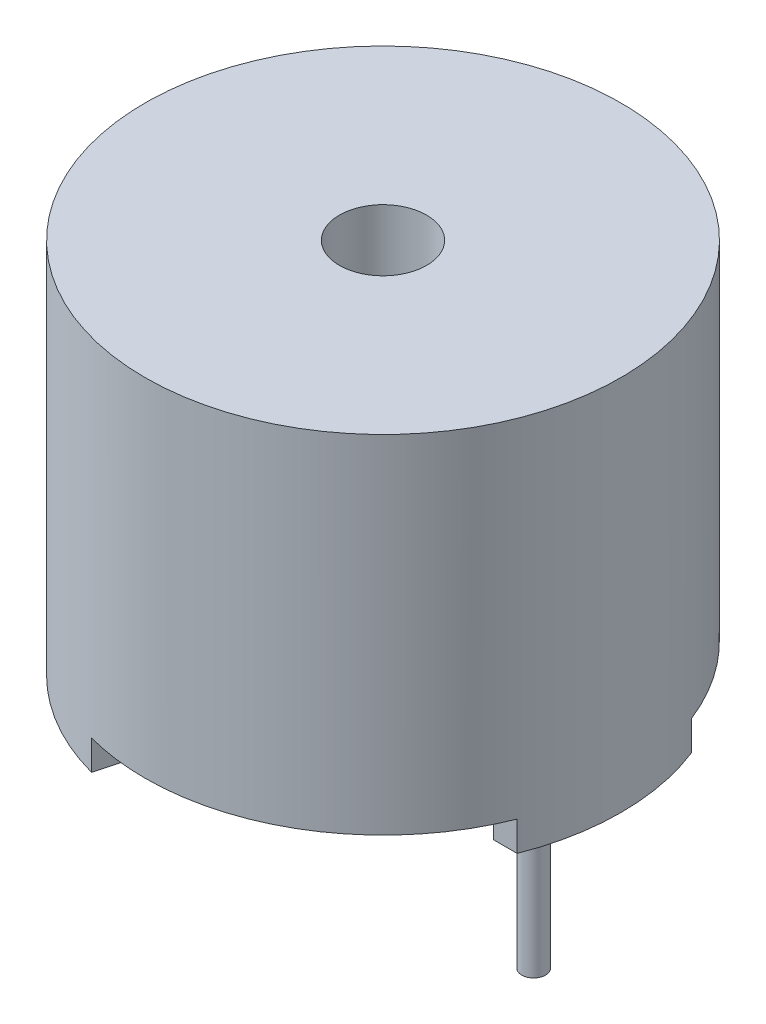
ISO-10303-21;
HEADER;
FILE_DESCRIPTION(('STEP AP214'),'2;1');
FILE_NAME('part.step','',(''),(''),'','','');
FILE_SCHEMA(('AUTOMOTIVE_DESIGN { 1 0 10303 214 1 1 1 1 }'));
ENDSEC;
DATA;
#1=APPLICATION_CONTEXT('core data for automotive mechanical design processes');
#2=APPLICATION_PROTOCOL_DEFINITION('international standard','automotive_design',2000,#1);
#3=PRODUCT_CONTEXT('',#1,'mechanical');
#4=PRODUCT('Part','Part','',(#3));
#5=PRODUCT_RELATED_PRODUCT_CATEGORY('part','',(#4));
#6=PRODUCT_DEFINITION_FORMATION('','',#4);
#7=PRODUCT_DEFINITION_CONTEXT('part definition',#1,'design');
#8=PRODUCT_DEFINITION('design','',#6,#7);
#9=PRODUCT_DEFINITION_SHAPE('','',#8);
#10=(LENGTH_UNIT() NAMED_UNIT(*) SI_UNIT(.MILLI.,.METRE.));
#11=(NAMED_UNIT(*) PLANE_ANGLE_UNIT() SI_UNIT($,.RADIAN.));
#12=(NAMED_UNIT(*) SI_UNIT($,.STERADIAN.) SOLID_ANGLE_UNIT());
#13=UNCERTAINTY_MEASURE_WITH_UNIT(LENGTH_MEASURE(1.E-05),#10,'distance_accuracy_value','');
#14=(GEOMETRIC_REPRESENTATION_CONTEXT(3) GLOBAL_UNCERTAINTY_ASSIGNED_CONTEXT((#13)) GLOBAL_UNIT_ASSIGNED_CONTEXT((#10,
#11,#12)) REPRESENTATION_CONTEXT('',''));
#15=CARTESIAN_POINT('',(0.,0.,0.));
#16=DIRECTION('',(0.,0.,1.));
#17=DIRECTION('',(1.,0.,0.));
#18=AXIS2_PLACEMENT_3D('',#15,#16,#17);
#19=CARTESIAN_POINT('',(0.,6.5,0.));
#20=DIRECTION('',(0.,1.,0.));
#21=DIRECTION('',(0.,0.,1.));
#22=AXIS2_PLACEMENT_3D('',#19,#20,#21);
#23=PLANE('',#22);
#24=CARTESIAN_POINT('',(0.,6.5,0.));
#25=DIRECTION('',(0.,-1.,0.));
#26=DIRECTION('',(0.,0.,-1.));
#27=AXIS2_PLACEMENT_3D('',#24,#25,#26);
#28=CIRCLE('',#27,1.1);
#29=CARTESIAN_POINT('',(0.,6.5,-1.1));
#30=VERTEX_POINT('',#29);
#31=EDGE_CURVE('E20',#30,#30,#28,.F.);
#32=ORIENTED_EDGE('',*,*,#31,.T.);
#33=EDGE_LOOP('',(#32));
#34=FACE_BOUND('',#33,.T.);
#35=ADVANCED_FACE('F17',(#34),#23,.T.);
#36=CARTESIAN_POINT('',(0.,-3.5,0.));
#37=DIRECTION('',(0.,1.,0.));
#38=DIRECTION('',(0.,0.,1.));
#39=AXIS2_PLACEMENT_3D('',#36,#37,#38);
#40=PLANE('',#39);
#41=CARTESIAN_POINT('',(-3.8,-3.49999999997408,0.));
#42=DIRECTION('',(0.,1.,0.));
#43=DIRECTION('',(0.,0.,1.));
#44=AXIS2_PLACEMENT_3D('',#41,#42,#43);
#45=CIRCLE('',#44,0.3);
#46=CARTESIAN_POINT('',(-3.8,-3.49999999997408,0.299999999999999));
#47=VERTEX_POINT('',#46);
#48=EDGE_CURVE('E160',#47,#47,#45,.T.);
#49=ORIENTED_EDGE('',*,*,#48,.F.);
#50=EDGE_LOOP('',(#49));
#51=FACE_BOUND('',#50,.T.);
#52=ADVANCED_FACE('F448',(#51),#40,.F.);
#53=CARTESIAN_POINT('',(3.8,-4.5,0.));
#54=DIRECTION('',(0.,-1.,0.));
#55=DIRECTION('',(0.,0.,-1.));
#56=AXIS2_PLACEMENT_3D('',#53,#54,#55);
#57=PLANE('',#56);
#58=CARTESIAN_POINT('',(3.8,-4.50000000000728,0.));
#59=DIRECTION('',(0.,1.,0.));
#60=DIRECTION('',(0.,0.,1.));
#61=AXIS2_PLACEMENT_3D('',#58,#59,#60);
#62=CIRCLE('',#61,0.3);
#63=CARTESIAN_POINT('',(3.8,-4.50000000000728,0.3));
#64=VERTEX_POINT('',#63);
#65=EDGE_CURVE('E157',#64,#64,#62,.T.);
#66=ORIENTED_EDGE('',*,*,#65,.F.);
#67=EDGE_LOOP('',(#66));
#68=FACE_BOUND('',#67,.T.);
#69=ADVANCED_FACE('F438',(#68),#57,.T.);
#70=CARTESIAN_POINT('',(0.,6.5,0.));
#71=DIRECTION('',(0.,-1.,0.));
#72=DIRECTION('',(0.,0.,-1.));
#73=AXIS2_PLACEMENT_3D('',#70,#71,#72);
#74=CYLINDRICAL_SURFACE('',#73,1.1);
#75=CARTESIAN_POINT('',(0.,9.5,0.));
#76=DIRECTION('',(0.,-1.,0.));
#77=DIRECTION('',(0.,0.,-1.));
#78=AXIS2_PLACEMENT_3D('',#75,#76,#77);
#79=CIRCLE('',#78,1.1);
#80=CARTESIAN_POINT('',(0.,9.5,-1.1));
#81=VERTEX_POINT('',#80);
#82=EDGE_CURVE('E106',#81,#81,#79,.T.);
#83=ORIENTED_EDGE('',*,*,#82,.F.);
#84=EDGE_LOOP('',(#83));
#85=FACE_BOUND('',#84,.T.);
#86=ORIENTED_EDGE('',*,*,#31,.F.);
#87=EDGE_LOOP('',(#86));
#88=FACE_BOUND('',#87,.T.);
#89=ADVANCED_FACE('F429',(#85,#88),#74,.F.);
#90=CARTESIAN_POINT('',(0.,0.,0.));
#91=DIRECTION('',(0.,1.,0.));
#92=DIRECTION('',(0.,0.,1.));
#93=AXIS2_PLACEMENT_3D('',#90,#91,#92);
#94=PLANE('',#93);
#95=CARTESIAN_POINT('',(0.,0.,0.));
#96=DIRECTION('',(0.,1.,0.));
#97=DIRECTION('',(0.,0.,1.));
#98=AXIS2_PLACEMENT_3D('',#95,#96,#97);
#99=CIRCLE('',#98,5.446233822217);
#100=CARTESIAN_POINT('',(4.98211429478096,0.,2.2));
#101=VERTEX_POINT('',#100);
#102=CARTESIAN_POINT('',(4.98211429478093,0.,-2.19999999999999));
#103=VERTEX_POINT('',#102);
#104=EDGE_CURVE('E80',#101,#103,#99,.T.);
#105=ORIENTED_EDGE('',*,*,#104,.T.);
#106=DIRECTION('',(-1.,0.,0.));
#107=VECTOR('',#106,1.);
#108=CARTESIAN_POINT('',(5.582114294781,0.,-2.2));
#109=LINE('',#108,#107);
#110=CARTESIAN_POINT('',(5.58211429478114,0.,-2.20000000000002));
#111=VERTEX_POINT('',#110);
#112=EDGE_CURVE('E69',#111,#103,#109,.T.);
#113=ORIENTED_EDGE('',*,*,#112,.F.);
#114=CARTESIAN_POINT('',(0.,0.,0.));
#115=DIRECTION('',(0.,1.,0.));
#116=DIRECTION('',(0.,0.,1.));
#117=AXIS2_PLACEMENT_3D('',#114,#115,#116);
#118=CIRCLE('',#117,6.);
#119=CARTESIAN_POINT('',(5.58211429478114,0.,2.20000000000003));
#120=VERTEX_POINT('',#119);
#121=EDGE_CURVE('E96',#120,#111,#118,.T.);
#122=ORIENTED_EDGE('',*,*,#121,.F.);
#123=DIRECTION('',(1.,0.,0.));
#124=VECTOR('',#123,1.);
#125=CARTESIAN_POINT('',(5.582114294781,0.,2.2));
#126=LINE('',#125,#124);
#127=EDGE_CURVE('E63',#101,#120,#126,.T.);
#128=ORIENTED_EDGE('',*,*,#127,.F.);
#129=EDGE_LOOP('',(#105,#113,#122,#128));
#130=FACE_BOUND('',#129,.T.);
#131=ADVANCED_FACE('F81',(#130),#94,.F.);
#132=CARTESIAN_POINT('',(0.,0.75,0.));
#133=DIRECTION('',(0.,1.,0.));
#134=DIRECTION('',(0.,0.,1.));
#135=AXIS2_PLACEMENT_3D('',#132,#133,#134);
#136=CYLINDRICAL_SURFACE('',#135,5.4);
#137=DIRECTION('',(0.,1.,0.));
#138=VECTOR('',#137,1.);
#139=CARTESIAN_POINT('',(-1.39762284355335,0.75,-5.21599946196117));
#140=LINE('',#139,#138);
#141=CARTESIAN_POINT('',(-1.39762284355366,0.75,-5.21599946196102));
#142=VERTEX_POINT('',#141);
#143=CARTESIAN_POINT('',(-1.39762284355366,0.,-5.21599946196102));
#144=VERTEX_POINT('',#143);
#145=EDGE_CURVE('E95',#142,#144,#140,.F.);
#146=ORIENTED_EDGE('',*,*,#145,.F.);
#147=CARTESIAN_POINT('',(0.,0.75,0.));
#148=DIRECTION('',(0.,1.,0.));
#149=DIRECTION('',(0.,0.,1.));
#150=AXIS2_PLACEMENT_3D('',#147,#148,#149);
#151=CIRCLE('',#150,5.4);
#152=CARTESIAN_POINT('',(-3.81837661840718,0.75,-3.81837661840718));
#153=VERTEX_POINT('',#152);
#154=EDGE_CURVE('E142',#153,#142,#151,.F.);
#155=ORIENTED_EDGE('',*,*,#154,.F.);
#156=DIRECTION('',(0.,1.,0.));
#157=VECTOR('',#156,1.);
#158=CARTESIAN_POINT('',(-3.818376618407,0.75,-3.818376618407));
#159=LINE('',#158,#157);
#160=CARTESIAN_POINT('',(-3.81837661840718,0.,-3.81837661840718));
#161=VERTEX_POINT('',#160);
#162=EDGE_CURVE('E100',#161,#153,#159,.T.);
#163=ORIENTED_EDGE('',*,*,#162,.F.);
#164=CARTESIAN_POINT('',(0.,0.,0.));
#165=DIRECTION('',(0.,1.,0.));
#166=DIRECTION('',(0.,0.,1.));
#167=AXIS2_PLACEMENT_3D('',#164,#165,#166);
#168=CIRCLE('',#167,5.4);
#169=EDGE_CURVE('E99',#161,#144,#168,.F.);
#170=ORIENTED_EDGE('',*,*,#169,.T.);
#171=EDGE_LOOP('',(#146,#155,#163,#170));
#172=FACE_BOUND('',#171,.T.);
#173=ADVANCED_FACE('F411',(#172),#136,.F.);
#174=CARTESIAN_POINT('',(5.582114294781,0.75,-2.2));
#175=DIRECTION('',(0.,0.,-1.));
#176=DIRECTION('',(-1.,0.,0.));
#177=AXIS2_PLACEMENT_3D('',#174,#175,#176);
#178=PLANE('',#177);
#179=DIRECTION('',(1.,0.,0.));
#180=VECTOR('',#179,1.);
#181=CARTESIAN_POINT('',(0.274198215041,0.75,-2.2));
#182=LINE('',#181,#180);
#183=CARTESIAN_POINT('',(5.58211429478114,0.750000000000001,-2.20000000000002));
#184=VERTEX_POINT('',#183);
#185=CARTESIAN_POINT('',(4.98211429478093,0.75,-2.19999999999999));
#186=VERTEX_POINT('',#185);
#187=EDGE_CURVE('E141',#184,#186,#182,.F.);
#188=ORIENTED_EDGE('',*,*,#187,.F.);
#189=DIRECTION('',(0.,1.,0.));
#190=VECTOR('',#189,1.);
#191=CARTESIAN_POINT('',(5.58211429478113,9.5,-2.20000000000005));
#192=LINE('',#191,#190);
#193=EDGE_CURVE('E77',#111,#184,#192,.T.);
#194=ORIENTED_EDGE('',*,*,#193,.F.);
#195=ORIENTED_EDGE('',*,*,#112,.T.);
#196=DIRECTION('',(0.,1.,0.));
#197=VECTOR('',#196,1.);
#198=CARTESIAN_POINT('',(4.98211429478093,0.75,-2.19999999999997));
#199=LINE('',#198,#197);
#200=EDGE_CURVE('E74',#103,#186,#199,.T.);
#201=ORIENTED_EDGE('',*,*,#200,.T.);
#202=EDGE_LOOP('',(#188,#194,#195,#201));
#203=FACE_BOUND('',#202,.T.);
#204=ADVANCED_FACE('F71',(#203),#178,.T.);
#205=CARTESIAN_POINT('',(0.,0.75,0.));
#206=DIRECTION('',(0.,1.,0.));
#207=DIRECTION('',(0.,0.,1.));
#208=AXIS2_PLACEMENT_3D('',#205,#206,#207);
#209=CYLINDRICAL_SURFACE('',#208,5.446233822217);
#210=DIRECTION('',(0.,-1.,0.));
#211=VECTOR('',#210,1.);
#212=CARTESIAN_POINT('',(4.982114294781,0.75,2.2));
#213=LINE('',#212,#211);
#214=CARTESIAN_POINT('',(4.98211429478096,0.75,2.2));
#215=VERTEX_POINT('',#214);
#216=EDGE_CURVE('E92',#215,#101,#213,.T.);
#217=ORIENTED_EDGE('',*,*,#216,.F.);
#218=CARTESIAN_POINT('',(0.,0.75,0.));
#219=DIRECTION('',(0.,1.,0.));
#220=DIRECTION('',(0.,0.,1.));
#221=AXIS2_PLACEMENT_3D('',#218,#219,#220);
#222=CIRCLE('',#221,5.446233822217);
#223=EDGE_CURVE('E87',#186,#215,#222,.F.);
#224=ORIENTED_EDGE('',*,*,#223,.F.);
#225=ORIENTED_EDGE('',*,*,#200,.F.);
#226=ORIENTED_EDGE('',*,*,#104,.F.);
#227=EDGE_LOOP('',(#217,#224,#225,#226));
#228=FACE_BOUND('',#227,.T.);
#229=ADVANCED_FACE('F85',(#228),#209,.F.);
#230=CARTESIAN_POINT('',(5.582114294781,0.75,2.2));
#231=DIRECTION('',(0.,0.,1.));
#232=DIRECTION('',(0.,-1.,0.));
#233=AXIS2_PLACEMENT_3D('',#230,#231,#232);
#234=PLANE('',#233);
#235=DIRECTION('',(1.,0.,0.));
#236=VECTOR('',#235,1.);
#237=CARTESIAN_POINT('',(0.274198215041,0.75,2.2));
#238=LINE('',#237,#236);
#239=CARTESIAN_POINT('',(5.58211429478114,0.750000000000001,2.20000000000003));
#240=VERTEX_POINT('',#239);
#241=EDGE_CURVE('E139',#215,#240,#238,.T.);
#242=ORIENTED_EDGE('',*,*,#241,.F.);
#243=ORIENTED_EDGE('',*,*,#216,.T.);
#244=ORIENTED_EDGE('',*,*,#127,.T.);
#245=DIRECTION('',(0.,1.,0.));
#246=VECTOR('',#245,1.);
#247=CARTESIAN_POINT('',(5.58211429478113,9.5,2.20000000000005));
#248=LINE('',#247,#246);
#249=EDGE_CURVE('E104',#240,#120,#248,.F.);
#250=ORIENTED_EDGE('',*,*,#249,.F.);
#251=EDGE_LOOP('',(#242,#243,#244,#250));
#252=FACE_BOUND('',#251,.T.);
#253=ADVANCED_FACE('F166',(#252),#234,.T.);
#254=CARTESIAN_POINT('',(-3.8,500000.,0.));
#255=DIRECTION('',(0.,1.,0.));
#256=DIRECTION('',(0.,0.,1.));
#257=AXIS2_PLACEMENT_3D('',#254,#255,#256);
#258=CYLINDRICAL_SURFACE('',#257,0.3);
#259=CARTESIAN_POINT('',(-3.8,0.749999999982265,0.));
#260=DIRECTION('',(0.,1.,0.));
#261=DIRECTION('',(0.,0.,1.));
#262=AXIS2_PLACEMENT_3D('',#259,#260,#261);
#263=CIRCLE('',#262,0.3);
#264=CARTESIAN_POINT('',(-3.8,0.749999999982265,0.299999999999999));
#265=VERTEX_POINT('',#264);
#266=EDGE_CURVE('E136',#265,#265,#263,.T.);
#267=ORIENTED_EDGE('',*,*,#266,.F.);
#268=EDGE_LOOP('',(#267));
#269=FACE_BOUND('',#268,.T.);
#270=ORIENTED_EDGE('',*,*,#48,.T.);
#271=EDGE_LOOP('',(#270));
#272=FACE_BOUND('',#271,.T.);
#273=ADVANCED_FACE('F268',(#269,#272),#258,.T.);
#274=CARTESIAN_POINT('',(3.8,500000.,0.));
#275=DIRECTION('',(0.,1.,0.));
#276=DIRECTION('',(0.,0.,1.));
#277=AXIS2_PLACEMENT_3D('',#274,#275,#276);
#278=CYLINDRICAL_SURFACE('',#277,0.3);
#279=CARTESIAN_POINT('',(3.8,0.749999999982265,0.));
#280=DIRECTION('',(0.,1.,0.));
#281=DIRECTION('',(0.,0.,1.));
#282=AXIS2_PLACEMENT_3D('',#279,#280,#281);
#283=CIRCLE('',#282,0.3);
#284=CARTESIAN_POINT('',(3.8,0.749999999982265,0.3));
#285=VERTEX_POINT('',#284);
#286=EDGE_CURVE('E132',#285,#285,#283,.T.);
#287=ORIENTED_EDGE('',*,*,#286,.F.);
#288=EDGE_LOOP('',(#287));
#289=FACE_BOUND('',#288,.T.);
#290=ORIENTED_EDGE('',*,*,#65,.T.);
#291=EDGE_LOOP('',(#290));
#292=FACE_BOUND('',#291,.T.);
#293=ADVANCED_FACE('F259',(#289,#292),#278,.T.);
#294=CARTESIAN_POINT('',(0.,0.75,0.));
#295=DIRECTION('',(0.,1.,0.));
#296=DIRECTION('',(0.,0.,1.));
#297=AXIS2_PLACEMENT_3D('',#294,#295,#296);
#298=CYLINDRICAL_SURFACE('',#297,5.4);
#299=DIRECTION('',(0.,1.,0.));
#300=VECTOR('',#299,1.);
#301=CARTESIAN_POINT('',(-3.818376618407,0.75,3.818376618407));
#302=LINE('',#301,#300);
#303=CARTESIAN_POINT('',(-3.81837661840718,0.75,3.81837661840718));
#304=VERTEX_POINT('',#303);
#305=CARTESIAN_POINT('',(-3.81837661840718,0.,3.81837661840718));
#306=VERTEX_POINT('',#305);
#307=EDGE_CURVE('E131',#304,#306,#302,.F.);
#308=ORIENTED_EDGE('',*,*,#307,.F.);
#309=CARTESIAN_POINT('',(0.,0.75,0.));
#310=DIRECTION('',(0.,1.,0.));
#311=DIRECTION('',(0.,0.,1.));
#312=AXIS2_PLACEMENT_3D('',#309,#310,#311);
#313=CIRCLE('',#312,5.4);
#314=CARTESIAN_POINT('',(-1.39762284355364,0.75,5.21599946196096));
#315=VERTEX_POINT('',#314);
#316=EDGE_CURVE('E147',#315,#304,#313,.F.);
#317=ORIENTED_EDGE('',*,*,#316,.F.);
#318=DIRECTION('',(0.,1.,0.));
#319=VECTOR('',#318,1.);
#320=CARTESIAN_POINT('',(-1.39762284355397,0.75,5.21599946196087));
#321=LINE('',#320,#319);
#322=CARTESIAN_POINT('',(-1.39762284355364,0.,5.21599946196096));
#323=VERTEX_POINT('',#322);
#324=EDGE_CURVE('E156',#323,#315,#321,.T.);
#325=ORIENTED_EDGE('',*,*,#324,.F.);
#326=CARTESIAN_POINT('',(0.,0.,0.));
#327=DIRECTION('',(0.,1.,0.));
#328=DIRECTION('',(0.,0.,1.));
#329=AXIS2_PLACEMENT_3D('',#326,#327,#328);
#330=CIRCLE('',#329,5.4);
#331=EDGE_CURVE('E127',#323,#306,#330,.F.);
#332=ORIENTED_EDGE('',*,*,#331,.T.);
#333=EDGE_LOOP('',(#308,#317,#325,#332));
#334=FACE_BOUND('',#333,.T.);
#335=ADVANCED_FACE('F256',(#334),#298,.F.);
#336=CARTESIAN_POINT('',(0.,9.5,0.));
#337=DIRECTION('',(0.,1.,0.));
#338=DIRECTION('',(0.,0.,1.));
#339=AXIS2_PLACEMENT_3D('',#336,#337,#338);
#340=PLANE('',#339);
#341=ORIENTED_EDGE('',*,*,#82,.T.);
#342=EDGE_LOOP('',(#341));
#343=FACE_BOUND('',#342,.T.);
#344=CARTESIAN_POINT('',(0.,9.5,0.));
#345=DIRECTION('',(0.,1.,0.));
#346=DIRECTION('',(0.,0.,1.));
#347=AXIS2_PLACEMENT_3D('',#344,#345,#346);
#348=CIRCLE('',#347,6.);
#349=CARTESIAN_POINT('',(0.,9.5,6.));
#350=VERTEX_POINT('',#349);
#351=EDGE_CURVE('E123',#350,#350,#348,.F.);
#352=ORIENTED_EDGE('',*,*,#351,.F.);
#353=EDGE_LOOP('',(#352));
#354=FACE_BOUND('',#353,.T.);
#355=ADVANCED_FACE('F258',(#343,#354),#340,.T.);
#356=CARTESIAN_POINT('',(-1.552914270615,0.75,-5.795554957734));
#357=DIRECTION('',(0.965925826288944,0.,-0.258819045102985));
#358=DIRECTION('',(-0.258819045102985,0.,-0.965925826288944));
#359=AXIS2_PLACEMENT_3D('',#356,#357,#358);
#360=PLANE('',#359);
#361=DIRECTION('',(-0.258819045101908,0.,-0.965925826289232));
#362=VECTOR('',#361,1.);
#363=CARTESIAN_POINT('',(-1.397622843554,0.75,-5.215999461961));
#364=LINE('',#363,#362);
#365=CARTESIAN_POINT('',(-1.55291427061511,0.750000000000001,-5.79555495773441));
#366=VERTEX_POINT('',#365);
#367=EDGE_CURVE('E145',#142,#366,#364,.T.);
#368=ORIENTED_EDGE('',*,*,#367,.F.);
#369=ORIENTED_EDGE('',*,*,#145,.T.);
#370=DIRECTION('',(-0.258819045101908,0.,-0.965925826289232));
#371=VECTOR('',#370,1.);
#372=CARTESIAN_POINT('',(-1.397622843554,0.,-5.215999461961));
#373=LINE('',#372,#371);
#374=CARTESIAN_POINT('',(-1.55291427061511,0.,-5.79555495773441));
#375=VERTEX_POINT('',#374);
#376=EDGE_CURVE('E152',#144,#375,#373,.T.);
#377=ORIENTED_EDGE('',*,*,#376,.T.);
#378=DIRECTION('',(0.,1.,0.));
#379=VECTOR('',#378,1.);
#380=CARTESIAN_POINT('',(-1.55291427061511,9.5,-5.79555495773441));
#381=LINE('',#380,#379);
#382=EDGE_CURVE('E119',#366,#375,#381,.F.);
#383=ORIENTED_EDGE('',*,*,#382,.F.);
#384=EDGE_LOOP('',(#368,#369,#377,#383));
#385=FACE_BOUND('',#384,.T.);
#386=ADVANCED_FACE('F247',(#385),#360,.T.);
#387=CARTESIAN_POINT('',(0.,0.,0.));
#388=DIRECTION('',(0.,1.,0.));
#389=DIRECTION('',(0.,0.,1.));
#390=AXIS2_PLACEMENT_3D('',#387,#388,#389);
#391=PLANE('',#390);
#392=CARTESIAN_POINT('',(0.,0.,0.));
#393=DIRECTION('',(0.,1.,0.));
#394=DIRECTION('',(0.,0.,1.));
#395=AXIS2_PLACEMENT_3D('',#392,#393,#394);
#396=CIRCLE('',#395,6.);
#397=CARTESIAN_POINT('',(-4.24264068711929,0.,-4.24264068711929));
#398=VERTEX_POINT('',#397);
#399=EDGE_CURVE('E116',#375,#398,#396,.T.);
#400=ORIENTED_EDGE('',*,*,#399,.F.);
#401=ORIENTED_EDGE('',*,*,#376,.F.);
#402=ORIENTED_EDGE('',*,*,#169,.F.);
#403=DIRECTION('',(0.707106781186548,0.,0.707106781186548));
#404=VECTOR('',#403,1.);
#405=CARTESIAN_POINT('',(-3.818376618407,0.,-3.818376618407));
#406=LINE('',#405,#404);
#407=EDGE_CURVE('E103',#398,#161,#406,.T.);
#408=ORIENTED_EDGE('',*,*,#407,.F.);
#409=EDGE_LOOP('',(#400,#401,#402,#408));
#410=FACE_BOUND('',#409,.T.);
#411=ADVANCED_FACE('F250',(#410),#391,.F.);
#412=CARTESIAN_POINT('',(-3.818376618407,0.75,-3.818376618407));
#413=DIRECTION('',(-0.707106781186548,0.,0.707106781186548));
#414=DIRECTION('',(0.707106781186548,0.,0.707106781186548));
#415=AXIS2_PLACEMENT_3D('',#412,#413,#414);
#416=PLANE('',#415);
#417=DIRECTION('',(0.707106781186548,0.,0.707106781186547));
#418=VECTOR('',#417,1.);
#419=CARTESIAN_POINT('',(-4.242640687119,0.75,-4.242640687119));
#420=LINE('',#419,#418);
#421=CARTESIAN_POINT('',(-4.24264068711929,0.75,-4.24264068711929));
#422=VERTEX_POINT('',#421);
#423=EDGE_CURVE('E146',#422,#153,#420,.T.);
#424=ORIENTED_EDGE('',*,*,#423,.F.);
#425=DIRECTION('',(0.,1.,0.));
#426=VECTOR('',#425,1.);
#427=CARTESIAN_POINT('',(-4.24264068711928,9.5,-4.24264068711929));
#428=LINE('',#427,#426);
#429=EDGE_CURVE('E115',#398,#422,#428,.T.);
#430=ORIENTED_EDGE('',*,*,#429,.F.);
#431=ORIENTED_EDGE('',*,*,#407,.T.);
#432=ORIENTED_EDGE('',*,*,#162,.T.);
#433=EDGE_LOOP('',(#424,#430,#431,#432));
#434=FACE_BOUND('',#433,.T.);
#435=ADVANCED_FACE('F254',(#434),#416,.T.);
#436=CARTESIAN_POINT('',(0.274198215041,0.75,0.));
#437=DIRECTION('',(0.,-1.,0.));
#438=DIRECTION('',(0.,0.,-1.));
#439=AXIS2_PLACEMENT_3D('',#436,#437,#438);
#440=PLANE('',#439);
#441=ORIENTED_EDGE('',*,*,#286,.T.);
#442=EDGE_LOOP('',(#441));
#443=FACE_BOUND('',#442,.T.);
#444=ORIENTED_EDGE('',*,*,#266,.T.);
#445=EDGE_LOOP('',(#444));
#446=FACE_BOUND('',#445,.T.);
#447=ORIENTED_EDGE('',*,*,#223,.T.);
#448=ORIENTED_EDGE('',*,*,#241,.T.);
#449=CARTESIAN_POINT('',(0.,0.750000000000001,0.));
#450=DIRECTION('',(0.,1.,0.));
#451=DIRECTION('',(0.,0.,1.));
#452=AXIS2_PLACEMENT_3D('',#449,#450,#451);
#453=CIRCLE('',#452,6.);
#454=CARTESIAN_POINT('',(-1.55291427061511,0.750000000000001,5.79555495773441));
#455=VERTEX_POINT('',#454);
#456=EDGE_CURVE('E35',#240,#455,#453,.F.);
#457=ORIENTED_EDGE('',*,*,#456,.T.);
#458=DIRECTION('',(0.258819045102985,0.,-0.965925826288944));
#459=VECTOR('',#458,1.);
#460=CARTESIAN_POINT('',(-1.552914270615,0.75,5.795554957734));
#461=LINE('',#460,#459);
#462=EDGE_CURVE('E126',#315,#455,#461,.F.);
#463=ORIENTED_EDGE('',*,*,#462,.F.);
#464=ORIENTED_EDGE('',*,*,#316,.T.);
#465=DIRECTION('',(-0.707106781186548,0.,0.707106781186548));
#466=VECTOR('',#465,1.);
#467=CARTESIAN_POINT('',(-3.818376618407,0.75,3.818376618407));
#468=LINE('',#467,#466);
#469=CARTESIAN_POINT('',(-4.24264068711929,0.750000000000001,4.24264068711928));
#470=VERTEX_POINT('',#469);
#471=EDGE_CURVE('E135',#470,#304,#468,.F.);
#472=ORIENTED_EDGE('',*,*,#471,.F.);
#473=CARTESIAN_POINT('',(0.,0.750000000000001,0.));
#474=DIRECTION('',(0.,1.,0.));
#475=DIRECTION('',(0.,0.,1.));
#476=AXIS2_PLACEMENT_3D('',#473,#474,#475);
#477=CIRCLE('',#476,6.);
#478=EDGE_CURVE('E112',#422,#470,#477,.T.);
#479=ORIENTED_EDGE('',*,*,#478,.F.);
#480=ORIENTED_EDGE('',*,*,#423,.T.);
#481=ORIENTED_EDGE('',*,*,#154,.T.);
#482=ORIENTED_EDGE('',*,*,#367,.T.);
#483=CARTESIAN_POINT('',(0.,0.750000000000001,0.));
#484=DIRECTION('',(0.,1.,0.));
#485=DIRECTION('',(0.,0.,1.));
#486=AXIS2_PLACEMENT_3D('',#483,#484,#485);
#487=CIRCLE('',#486,6.);
#488=EDGE_CURVE('E120',#184,#366,#487,.T.);
#489=ORIENTED_EDGE('',*,*,#488,.F.);
#490=ORIENTED_EDGE('',*,*,#187,.T.);
#491=EDGE_LOOP('',(#447,#448,#457,#463,#464,#472,#479,#480,#481,#482,#489,#490));
#492=FACE_BOUND('',#491,.T.);
#493=ADVANCED_FACE('F242',(#443,#446,#492),#440,.T.);
#494=CARTESIAN_POINT('',(-3.818376618407,0.75,3.818376618407));
#495=DIRECTION('',(-0.707106781186548,0.,-0.707106781186548));
#496=DIRECTION('',(-0.707106781186548,0.,0.707106781186548));
#497=AXIS2_PLACEMENT_3D('',#494,#495,#496);
#498=PLANE('',#497);
#499=ORIENTED_EDGE('',*,*,#471,.T.);
#500=ORIENTED_EDGE('',*,*,#307,.T.);
#501=DIRECTION('',(-0.707106781186547,0.,0.707106781186547));
#502=VECTOR('',#501,1.);
#503=CARTESIAN_POINT('',(-3.818376618407,0.,3.818376618407));
#504=LINE('',#503,#502);
#505=CARTESIAN_POINT('',(-4.24264068711929,0.,4.24264068711928));
#506=VERTEX_POINT('',#505);
#507=EDGE_CURVE('E130',#306,#506,#504,.T.);
#508=ORIENTED_EDGE('',*,*,#507,.T.);
#509=DIRECTION('',(0.,1.,0.));
#510=VECTOR('',#509,1.);
#511=CARTESIAN_POINT('',(-4.24264068711929,9.5,4.24264068711928));
#512=LINE('',#511,#510);
#513=EDGE_CURVE('E111',#470,#506,#512,.F.);
#514=ORIENTED_EDGE('',*,*,#513,.F.);
#515=EDGE_LOOP('',(#499,#500,#508,#514));
#516=FACE_BOUND('',#515,.T.);
#517=ADVANCED_FACE('F213',(#516),#498,.T.);
#518=CARTESIAN_POINT('',(0.,0.,0.));
#519=DIRECTION('',(0.,1.,0.));
#520=DIRECTION('',(0.,0.,1.));
#521=AXIS2_PLACEMENT_3D('',#518,#519,#520);
#522=PLANE('',#521);
#523=CARTESIAN_POINT('',(0.,0.,0.));
#524=DIRECTION('',(0.,1.,0.));
#525=DIRECTION('',(0.,0.,1.));
#526=AXIS2_PLACEMENT_3D('',#523,#524,#525);
#527=CIRCLE('',#526,6.);
#528=CARTESIAN_POINT('',(-1.55291427061511,0.,5.79555495773441));
#529=VERTEX_POINT('',#528);
#530=EDGE_CURVE('E26',#506,#529,#527,.T.);
#531=ORIENTED_EDGE('',*,*,#530,.F.);
#532=ORIENTED_EDGE('',*,*,#507,.F.);
#533=ORIENTED_EDGE('',*,*,#331,.F.);
#534=DIRECTION('',(0.258819045102985,0.,-0.965925826288944));
#535=VECTOR('',#534,1.);
#536=CARTESIAN_POINT('',(-1.552914270615,0.,5.795554957734));
#537=LINE('',#536,#535);
#538=EDGE_CURVE('E217',#529,#323,#537,.T.);
#539=ORIENTED_EDGE('',*,*,#538,.F.);
#540=EDGE_LOOP('',(#531,#532,#533,#539));
#541=FACE_BOUND('',#540,.T.);
#542=ADVANCED_FACE('F219',(#541),#522,.F.);
#543=CARTESIAN_POINT('',(-1.552914270615,0.75,5.795554957734));
#544=DIRECTION('',(0.965925826288944,0.,0.258819045102985));
#545=DIRECTION('',(0.258819045102985,0.,-0.965925826288944));
#546=AXIS2_PLACEMENT_3D('',#543,#544,#545);
#547=PLANE('',#546);
#548=ORIENTED_EDGE('',*,*,#462,.T.);
#549=DIRECTION('',(0.,1.,0.));
#550=VECTOR('',#549,1.);
#551=CARTESIAN_POINT('',(-1.55291427061511,9.5,5.79555495773441));
#552=LINE('',#551,#550);
#553=EDGE_CURVE('E11',#529,#455,#552,.T.);
#554=ORIENTED_EDGE('',*,*,#553,.F.);
#555=ORIENTED_EDGE('',*,*,#538,.T.);
#556=ORIENTED_EDGE('',*,*,#324,.T.);
#557=EDGE_LOOP('',(#548,#554,#555,#556));
#558=FACE_BOUND('',#557,.T.);
#559=ADVANCED_FACE('F241',(#558),#547,.T.);
#560=CARTESIAN_POINT('',(0.,9.5,0.));
#561=DIRECTION('',(0.,1.,0.));
#562=DIRECTION('',(0.,0.,1.));
#563=AXIS2_PLACEMENT_3D('',#560,#561,#562);
#564=CYLINDRICAL_SURFACE('',#563,6.);
#565=ORIENTED_EDGE('',*,*,#351,.T.);
#566=EDGE_LOOP('',(#565));
#567=FACE_BOUND('',#566,.T.);
#568=ORIENTED_EDGE('',*,*,#553,.T.);
#569=ORIENTED_EDGE('',*,*,#456,.F.);
#570=ORIENTED_EDGE('',*,*,#249,.T.);
#571=ORIENTED_EDGE('',*,*,#121,.T.);
#572=ORIENTED_EDGE('',*,*,#193,.T.);
#573=ORIENTED_EDGE('',*,*,#488,.T.);
#574=ORIENTED_EDGE('',*,*,#382,.T.);
#575=ORIENTED_EDGE('',*,*,#399,.T.);
#576=ORIENTED_EDGE('',*,*,#429,.T.);
#577=ORIENTED_EDGE('',*,*,#478,.T.);
#578=ORIENTED_EDGE('',*,*,#513,.T.);
#579=ORIENTED_EDGE('',*,*,#530,.T.);
#580=EDGE_LOOP('',(#568,#569,#570,#571,#572,#573,#574,#575,#576,#577,#578,#579));
#581=FACE_BOUND('',#580,.T.);
#582=ADVANCED_FACE('F222',(#567,#581),#564,.T.);
#583=CLOSED_SHELL('',(#35,#52,#69,#89,#131,#173,#204,#229,#253,#273,#293,#335,#355,#386,#411,
#435,#493,#517,#542,#559,#582));
#584=MANIFOLD_SOLID_BREP('B1',#583);
#585=ADVANCED_BREP_SHAPE_REPRESENTATION('',(#18,#584),#14);
#586=SHAPE_DEFINITION_REPRESENTATION(#9,#585);
ENDSEC;
END-ISO-10303-21;
